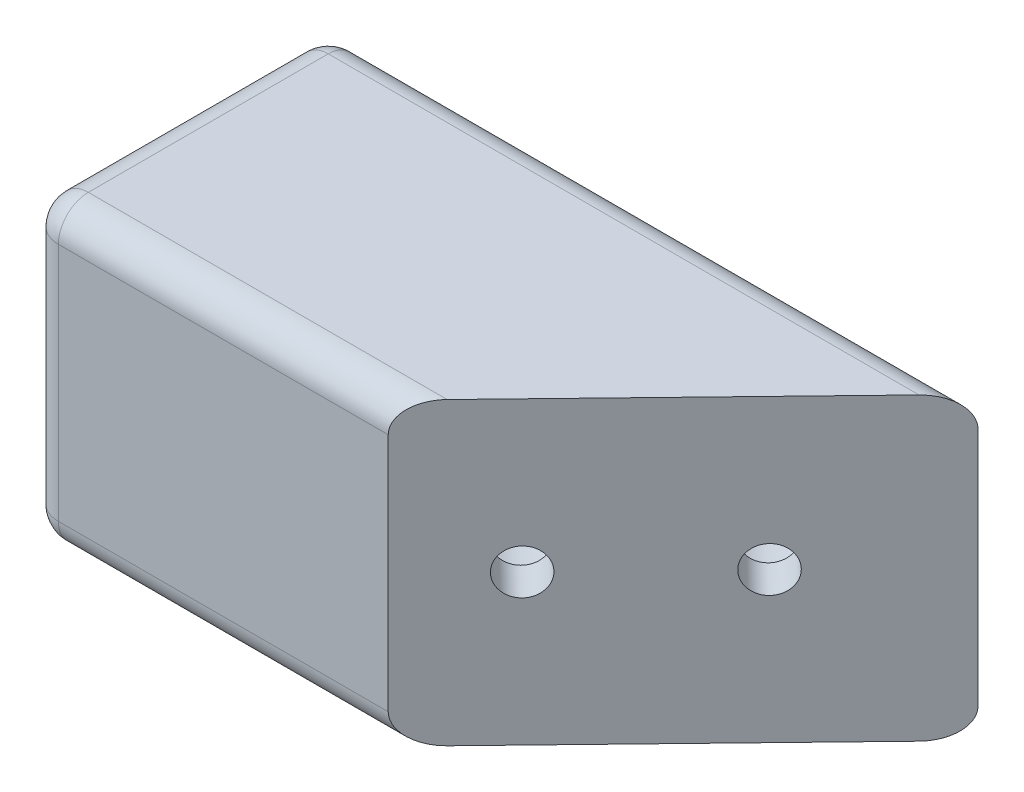
ISO-10303-21;
HEADER;
FILE_DESCRIPTION(('STEP AP214'),'2;1');
FILE_NAME('part.step','',(''),(''),'','','');
FILE_SCHEMA(('AUTOMOTIVE_DESIGN { 1 0 10303 214 1 1 1 1 }'));
ENDSEC;
DATA;
#1=APPLICATION_CONTEXT('core data for automotive mechanical design processes');
#2=APPLICATION_PROTOCOL_DEFINITION('international standard','automotive_design',2000,#1);
#3=PRODUCT_CONTEXT('',#1,'mechanical');
#4=PRODUCT('Part','Part','',(#3));
#5=PRODUCT_RELATED_PRODUCT_CATEGORY('part','',(#4));
#6=PRODUCT_DEFINITION_FORMATION('','',#4);
#7=PRODUCT_DEFINITION_CONTEXT('part definition',#1,'design');
#8=PRODUCT_DEFINITION('design','',#6,#7);
#9=PRODUCT_DEFINITION_SHAPE('','',#8);
#10=(LENGTH_UNIT() NAMED_UNIT(*) SI_UNIT(.MILLI.,.METRE.));
#11=(NAMED_UNIT(*) PLANE_ANGLE_UNIT() SI_UNIT($,.RADIAN.));
#12=(NAMED_UNIT(*) SI_UNIT($,.STERADIAN.) SOLID_ANGLE_UNIT());
#13=UNCERTAINTY_MEASURE_WITH_UNIT(LENGTH_MEASURE(1.E-05),#10,'distance_accuracy_value','');
#14=(GEOMETRIC_REPRESENTATION_CONTEXT(3) GLOBAL_UNCERTAINTY_ASSIGNED_CONTEXT((#13)) GLOBAL_UNIT_ASSIGNED_CONTEXT((#10,
#11,#12)) REPRESENTATION_CONTEXT('',''));
#15=CARTESIAN_POINT('',(0.,0.,0.));
#16=DIRECTION('',(0.,0.,1.));
#17=DIRECTION('',(1.,0.,0.));
#18=AXIS2_PLACEMENT_3D('',#15,#16,#17);
#19=CARTESIAN_POINT('',(-32.5,30.,-15.));
#20=DIRECTION('',(0.,0.,1.));
#21=DIRECTION('',(1.,0.,0.));
#22=AXIS2_PLACEMENT_3D('',#19,#20,#21);
#23=PLANE('',#22);
#24=CARTESIAN_POINT('',(-13.9014024104868,15.,-15.));
#25=DIRECTION('',(0.,0.,1.));
#26=DIRECTION('',(1.,0.,0.));
#27=AXIS2_PLACEMENT_3D('',#24,#25,#26);
#28=ELLIPSE('',#27,7.19401587759485,5.);
#29=CARTESIAN_POINT('',(-6.70738653289192,15.,-15.));
#30=VERTEX_POINT('',#29);
#31=EDGE_CURVE('E210',#30,#30,#28,.T.);
#32=ORIENTED_EDGE('',*,*,#31,.T.);
#33=EDGE_LOOP('',(#32));
#34=FACE_BOUND('',#33,.T.);
#35=CARTESIAN_POINT('',(11.2776531610952,15.,-15.));
#36=DIRECTION('',(0.,0.,1.));
#37=DIRECTION('',(1.,0.,0.));
#38=AXIS2_PLACEMENT_3D('',#35,#36,#37);
#39=ELLIPSE('',#38,7.19401587759485,5.);
#40=CARTESIAN_POINT('',(18.4716690386901,15.,-15.));
#41=VERTEX_POINT('',#40);
#42=EDGE_CURVE('E221',#41,#41,#39,.T.);
#43=ORIENTED_EDGE('',*,*,#42,.T.);
#44=EDGE_LOOP('',(#43));
#45=FACE_BOUND('',#44,.T.);
#46=DIRECTION('',(0.,-1.,0.));
#47=VECTOR('',#46,1.);
#48=CARTESIAN_POINT('',(32.5,30.,-15.));
#49=LINE('',#48,#47);
#50=CARTESIAN_POINT('',(32.5,27.,-15.));
#51=VERTEX_POINT('',#50);
#52=CARTESIAN_POINT('',(32.5,3.,-15.));
#53=VERTEX_POINT('',#52);
#54=EDGE_CURVE('E129',#51,#53,#49,.T.);
#55=ORIENTED_EDGE('',*,*,#54,.T.);
#56=DIRECTION('',(-1.,0.,0.));
#57=VECTOR('',#56,1.);
#58=CARTESIAN_POINT('',(-32.5,3.,-15.));
#59=LINE('',#58,#57);
#60=CARTESIAN_POINT('',(-29.5,3.,-15.));
#61=VERTEX_POINT('',#60);
#62=EDGE_CURVE('E11',#53,#61,#59,.T.);
#63=ORIENTED_EDGE('',*,*,#62,.T.);
#64=DIRECTION('',(0.,-1.,0.));
#65=VECTOR('',#64,1.);
#66=CARTESIAN_POINT('',(-29.5,30.,-15.));
#67=LINE('',#66,#65);
#68=CARTESIAN_POINT('',(-29.5,27.,-15.));
#69=VERTEX_POINT('',#68);
#70=EDGE_CURVE('E42',#61,#69,#67,.F.);
#71=ORIENTED_EDGE('',*,*,#70,.T.);
#72=DIRECTION('',(-1.,0.,0.));
#73=VECTOR('',#72,1.);
#74=CARTESIAN_POINT('',(32.5,27.,-15.));
#75=LINE('',#74,#73);
#76=EDGE_CURVE('E165',#69,#51,#75,.F.);
#77=ORIENTED_EDGE('',*,*,#76,.T.);
#78=EDGE_LOOP('',(#55,#63,#71,#77));
#79=FACE_BOUND('',#78,.T.);
#80=ADVANCED_FACE('F33',(#34,#45,#79),#23,.F.);
#81=CARTESIAN_POINT('',(-32.5,30.,15.));
#82=DIRECTION('',(1.,0.,0.));
#83=DIRECTION('',(0.,0.,-1.));
#84=AXIS2_PLACEMENT_3D('',#81,#82,#83);
#85=PLANE('',#84);
#86=DIRECTION('',(0.,0.,1.));
#87=VECTOR('',#86,1.);
#88=CARTESIAN_POINT('',(-32.5,3.,15.));
#89=LINE('',#88,#87);
#90=CARTESIAN_POINT('',(-32.5,3.,-12.));
#91=VERTEX_POINT('',#90);
#92=CARTESIAN_POINT('',(-32.5,3.,12.));
#93=VERTEX_POINT('',#92);
#94=EDGE_CURVE('E160',#91,#93,#89,.T.);
#95=ORIENTED_EDGE('',*,*,#94,.T.);
#96=DIRECTION('',(0.,-1.,0.));
#97=VECTOR('',#96,1.);
#98=CARTESIAN_POINT('',(-32.5,30.,12.));
#99=LINE('',#98,#97);
#100=CARTESIAN_POINT('',(-32.5,27.,12.));
#101=VERTEX_POINT('',#100);
#102=EDGE_CURVE('E162',#93,#101,#99,.F.);
#103=ORIENTED_EDGE('',*,*,#102,.T.);
#104=DIRECTION('',(0.,0.,1.));
#105=VECTOR('',#104,1.);
#106=CARTESIAN_POINT('',(-32.5,27.,-15.));
#107=LINE('',#106,#105);
#108=CARTESIAN_POINT('',(-32.5,27.,-12.));
#109=VERTEX_POINT('',#108);
#110=EDGE_CURVE('E156',#101,#109,#107,.F.);
#111=ORIENTED_EDGE('',*,*,#110,.T.);
#112=DIRECTION('',(0.,-1.,0.));
#113=VECTOR('',#112,1.);
#114=CARTESIAN_POINT('',(-32.5,30.,-12.));
#115=LINE('',#114,#113);
#116=EDGE_CURVE('E158',#109,#91,#115,.T.);
#117=ORIENTED_EDGE('',*,*,#116,.T.);
#118=EDGE_LOOP('',(#95,#103,#111,#117));
#119=FACE_BOUND('',#118,.T.);
#120=ADVANCED_FACE('F252',(#119),#85,.F.);
#121=CARTESIAN_POINT('',(-32.5,30.,15.));
#122=DIRECTION('',(0.,0.,-1.));
#123=DIRECTION('',(-1.,0.,0.));
#124=AXIS2_PLACEMENT_3D('',#121,#122,#123);
#125=PLANE('',#124);
#126=DIRECTION('',(0.,-1.,0.));
#127=VECTOR('',#126,1.);
#128=CARTESIAN_POINT('',(-29.5,30.,15.));
#129=LINE('',#128,#127);
#130=CARTESIAN_POINT('',(-29.5,27.,15.));
#131=VERTEX_POINT('',#130);
#132=CARTESIAN_POINT('',(-29.5,3.,15.));
#133=VERTEX_POINT('',#132);
#134=EDGE_CURVE('E128',#131,#133,#129,.T.);
#135=ORIENTED_EDGE('',*,*,#134,.T.);
#136=DIRECTION('',(1.,0.,0.));
#137=VECTOR('',#136,1.);
#138=CARTESIAN_POINT('',(-32.5,3.,15.));
#139=LINE('',#138,#137);
#140=CARTESIAN_POINT('',(3.49999999999999,3.,15.));
#141=VERTEX_POINT('',#140);
#142=EDGE_CURVE('E127',#133,#141,#139,.T.);
#143=ORIENTED_EDGE('',*,*,#142,.T.);
#144=DIRECTION('',(0.,-1.,0.));
#145=VECTOR('',#144,1.);
#146=CARTESIAN_POINT('',(3.49999999999999,30.,15.));
#147=LINE('',#146,#145);
#148=CARTESIAN_POINT('',(3.49999999999999,27.,15.));
#149=VERTEX_POINT('',#148);
#150=EDGE_CURVE('E112',#149,#141,#147,.T.);
#151=ORIENTED_EDGE('',*,*,#150,.F.);
#152=DIRECTION('',(1.,0.,0.));
#153=VECTOR('',#152,1.);
#154=CARTESIAN_POINT('',(-32.5,27.,15.));
#155=LINE('',#154,#153);
#156=EDGE_CURVE('E124',#149,#131,#155,.F.);
#157=ORIENTED_EDGE('',*,*,#156,.T.);
#158=EDGE_LOOP('',(#135,#143,#151,#157));
#159=FACE_BOUND('',#158,.T.);
#160=ADVANCED_FACE('F123',(#159),#125,.F.);
#161=CARTESIAN_POINT('',(3.49999999999999,30.,15.));
#162=DIRECTION('',(-0.718988376049112,0.,-0.695022096847475));
#163=DIRECTION('',(-0.695022096847475,0.,0.718988376049112));
#164=AXIS2_PLACEMENT_3D('',#161,#162,#163);
#165=PLANE('',#164);
#166=CARTESIAN_POINT('',(10.0855373766689,15.,8.18737512758386));
#167=DIRECTION('',(0.718988376049112,0.,0.695022096847475));
#168=DIRECTION('',(0.695022096847475,0.,-0.718988376049112));
#169=AXIS2_PLACEMENT_3D('',#166,#167,#168);
#170=CIRCLE('',#169,2.25);
#171=CARTESIAN_POINT('',(11.6493370945757,15.,6.56965128147336));
#172=VERTEX_POINT('',#171);
#173=EDGE_CURVE('E217',#172,#172,#170,.T.);
#174=ORIENTED_EDGE('',*,*,#173,.F.);
#175=EDGE_LOOP('',(#174));
#176=FACE_BOUND('',#175,.T.);
#177=CARTESIAN_POINT('',(22.2484240714997,15.,-4.3949214532756));
#178=DIRECTION('',(0.718988376049112,0.,0.695022096847475));
#179=DIRECTION('',(0.695022096847475,0.,-0.718988376049112));
#180=AXIS2_PLACEMENT_3D('',#177,#178,#179);
#181=CIRCLE('',#180,2.25);
#182=CARTESIAN_POINT('',(23.8122237894066,15.,-6.0126452993861));
#183=VERTEX_POINT('',#182);
#184=EDGE_CURVE('E220',#183,#183,#181,.T.);
#185=ORIENTED_EDGE('',*,*,#184,.F.);
#186=EDGE_LOOP('',(#185));
#187=FACE_BOUND('',#186,.T.);
#188=ORIENTED_EDGE('',*,*,#150,.T.);
#189=CARTESIAN_POINT('',(6.39999999999999,3.,12.));
#190=DIRECTION('',(-0.718988376049112,0.,-0.695022096847475));
#191=DIRECTION('',(0.695022096847475,0.,-0.718988376049112));
#192=AXIS2_PLACEMENT_3D('',#189,#190,#191);
#193=ELLIPSE('',#192,4.17252920900501,3.);
#194=CARTESIAN_POINT('',(6.39999999999999,0.,12.));
#195=VERTEX_POINT('',#194);
#196=EDGE_CURVE('E118',#141,#195,#193,.F.);
#197=ORIENTED_EDGE('',*,*,#196,.T.);
#198=DIRECTION('',(0.695022096847475,0.,-0.718988376049112));
#199=VECTOR('',#198,1.);
#200=CARTESIAN_POINT('',(3.49999999999999,0.,15.));
#201=LINE('',#200,#199);
#202=CARTESIAN_POINT('',(29.6,0.,-12.));
#203=VERTEX_POINT('',#202);
#204=EDGE_CURVE('E224',#195,#203,#201,.T.);
#205=ORIENTED_EDGE('',*,*,#204,.T.);
#206=CARTESIAN_POINT('',(29.6,3.,-12.));
#207=DIRECTION('',(-0.718988376049112,0.,-0.695022096847475));
#208=DIRECTION('',(-0.695022096847475,0.,0.718988376049112));
#209=AXIS2_PLACEMENT_3D('',#206,#207,#208);
#210=ELLIPSE('',#209,4.17252920900501,3.);
#211=EDGE_CURVE('E119',#203,#53,#210,.F.);
#212=ORIENTED_EDGE('',*,*,#211,.T.);
#213=ORIENTED_EDGE('',*,*,#54,.F.);
#214=CARTESIAN_POINT('',(29.6,27.,-12.));
#215=DIRECTION('',(-0.718988376049112,0.,-0.695022096847475));
#216=DIRECTION('',(0.695022096847475,0.,-0.718988376049112));
#217=AXIS2_PLACEMENT_3D('',#214,#215,#216);
#218=ELLIPSE('',#217,4.17252920900501,3.);
#219=CARTESIAN_POINT('',(29.6,30.,-12.));
#220=VERTEX_POINT('',#219);
#221=EDGE_CURVE('E136',#51,#220,#218,.F.);
#222=ORIENTED_EDGE('',*,*,#221,.T.);
#223=DIRECTION('',(0.695022096847475,0.,-0.718988376049112));
#224=VECTOR('',#223,1.);
#225=CARTESIAN_POINT('',(3.49999999999999,30.,15.));
#226=LINE('',#225,#224);
#227=CARTESIAN_POINT('',(6.39999999999999,30.,12.));
#228=VERTEX_POINT('',#227);
#229=EDGE_CURVE('E114',#228,#220,#226,.T.);
#230=ORIENTED_EDGE('',*,*,#229,.F.);
#231=CARTESIAN_POINT('',(6.39999999999999,27.,12.));
#232=DIRECTION('',(-0.718988376049112,0.,-0.695022096847475));
#233=DIRECTION('',(-0.695022096847475,0.,0.718988376049112));
#234=AXIS2_PLACEMENT_3D('',#231,#232,#233);
#235=ELLIPSE('',#234,4.17252920900501,3.);
#236=EDGE_CURVE('E109',#228,#149,#235,.F.);
#237=ORIENTED_EDGE('',*,*,#236,.T.);
#238=EDGE_LOOP('',(#188,#197,#205,#212,#213,#222,#230,#237));
#239=FACE_BOUND('',#238,.T.);
#240=ADVANCED_FACE('F111',(#176,#187,#239),#165,.F.);
#241=CARTESIAN_POINT('',(0.,30.,0.));
#242=DIRECTION('',(0.,1.,0.));
#243=DIRECTION('',(0.,0.,1.));
#244=AXIS2_PLACEMENT_3D('',#241,#242,#243);
#245=PLANE('',#244);
#246=DIRECTION('',(0.,0.,1.));
#247=VECTOR('',#246,1.);
#248=CARTESIAN_POINT('',(-29.5,30.,15.));
#249=LINE('',#248,#247);
#250=CARTESIAN_POINT('',(-29.5,30.,-12.));
#251=VERTEX_POINT('',#250);
#252=CARTESIAN_POINT('',(-29.5,30.,12.));
#253=VERTEX_POINT('',#252);
#254=EDGE_CURVE('E152',#251,#253,#249,.T.);
#255=ORIENTED_EDGE('',*,*,#254,.T.);
#256=DIRECTION('',(1.,0.,0.));
#257=VECTOR('',#256,1.);
#258=CARTESIAN_POINT('',(3.49999999999999,30.,12.));
#259=LINE('',#258,#257);
#260=EDGE_CURVE('E154',#253,#228,#259,.T.);
#261=ORIENTED_EDGE('',*,*,#260,.T.);
#262=ORIENTED_EDGE('',*,*,#229,.T.);
#263=DIRECTION('',(-1.,0.,0.));
#264=VECTOR('',#263,1.);
#265=CARTESIAN_POINT('',(-32.5,30.,-12.));
#266=LINE('',#265,#264);
#267=EDGE_CURVE('E150',#220,#251,#266,.T.);
#268=ORIENTED_EDGE('',*,*,#267,.T.);
#269=EDGE_LOOP('',(#255,#261,#262,#268));
#270=FACE_BOUND('',#269,.T.);
#271=ADVANCED_FACE('F308',(#270),#245,.T.);
#272=CARTESIAN_POINT('',(0.,0.,0.));
#273=DIRECTION('',(0.,1.,0.));
#274=DIRECTION('',(0.,0.,1.));
#275=AXIS2_PLACEMENT_3D('',#272,#273,#274);
#276=PLANE('',#275);
#277=ORIENTED_EDGE('',*,*,#204,.F.);
#278=DIRECTION('',(1.,0.,0.));
#279=VECTOR('',#278,1.);
#280=CARTESIAN_POINT('',(0.,0.,12.));
#281=LINE('',#280,#279);
#282=CARTESIAN_POINT('',(-29.5,0.,12.));
#283=VERTEX_POINT('',#282);
#284=EDGE_CURVE('E148',#195,#283,#281,.F.);
#285=ORIENTED_EDGE('',*,*,#284,.T.);
#286=DIRECTION('',(0.,0.,1.));
#287=VECTOR('',#286,1.);
#288=CARTESIAN_POINT('',(-29.5,0.,0.));
#289=LINE('',#288,#287);
#290=CARTESIAN_POINT('',(-29.5,0.,-12.));
#291=VERTEX_POINT('',#290);
#292=EDGE_CURVE('E146',#283,#291,#289,.F.);
#293=ORIENTED_EDGE('',*,*,#292,.T.);
#294=DIRECTION('',(-1.,0.,0.));
#295=VECTOR('',#294,1.);
#296=CARTESIAN_POINT('',(0.,0.,-12.));
#297=LINE('',#296,#295);
#298=EDGE_CURVE('E144',#291,#203,#297,.F.);
#299=ORIENTED_EDGE('',*,*,#298,.T.);
#300=EDGE_LOOP('',(#277,#285,#293,#299));
#301=FACE_BOUND('',#300,.T.);
#302=ADVANCED_FACE('F327',(#301),#276,.F.);
#303=CARTESIAN_POINT('',(-11.3529544465933,15.,-36.8762540207656));
#304=DIRECTION('',(0.718988376049112,0.,0.695022096847475));
#305=DIRECTION('',(0.695022096847475,0.,-0.718988376049112));
#306=AXIS2_PLACEMENT_3D('',#303,#304,#305);
#307=CYLINDRICAL_SURFACE('',#306,2.25);
#308=CARTESIAN_POINT('',(19.3724705673033,15.,-7.17500984066549));
#309=DIRECTION('',(0.718988376049112,0.,0.695022096847475));
#310=DIRECTION('',(0.695022096847475,0.,-0.718988376049112));
#311=AXIS2_PLACEMENT_3D('',#308,#309,#310);
#312=CIRCLE('',#311,2.25);
#313=CARTESIAN_POINT('',(20.9362702852101,15.,-8.792733686776));
#314=VERTEX_POINT('',#313);
#315=EDGE_CURVE('E216',#314,#314,#312,.F.);
#316=ORIENTED_EDGE('',*,*,#315,.T.);
#317=EDGE_LOOP('',(#316));
#318=FACE_BOUND('',#317,.T.);
#319=ORIENTED_EDGE('',*,*,#184,.T.);
#320=EDGE_LOOP('',(#319));
#321=FACE_BOUND('',#320,.T.);
#322=ADVANCED_FACE('F329',(#318,#321),#307,.F.);
#323=CARTESIAN_POINT('',(-23.5158411414241,15.,-24.2939574399061));
#324=DIRECTION('',(0.718988376049112,0.,0.695022096847475));
#325=DIRECTION('',(0.695022096847475,0.,-0.718988376049112));
#326=AXIS2_PLACEMENT_3D('',#323,#324,#325);
#327=CYLINDRICAL_SURFACE('',#326,2.25);
#328=CARTESIAN_POINT('',(7.20958387247248,15.,5.40728674019396));
#329=DIRECTION('',(0.718988376049112,0.,0.695022096847475));
#330=DIRECTION('',(0.695022096847475,0.,-0.718988376049112));
#331=AXIS2_PLACEMENT_3D('',#328,#329,#330);
#332=CIRCLE('',#331,2.25);
#333=CARTESIAN_POINT('',(8.7733835903793,15.,3.78956289408345));
#334=VERTEX_POINT('',#333);
#335=EDGE_CURVE('E205',#334,#334,#332,.F.);
#336=ORIENTED_EDGE('',*,*,#335,.T.);
#337=EDGE_LOOP('',(#336));
#338=FACE_BOUND('',#337,.T.);
#339=ORIENTED_EDGE('',*,*,#173,.T.);
#340=EDGE_LOOP('',(#339));
#341=FACE_BOUND('',#340,.T.);
#342=ADVANCED_FACE('F336',(#338,#341),#327,.F.);
#343=CARTESIAN_POINT('',(-11.3529544465933,15.,-36.8762540207656));
#344=DIRECTION('',(0.718988376049112,0.,0.695022096847475));
#345=DIRECTION('',(0.695022096847475,0.,-0.718988376049112));
#346=AXIS2_PLACEMENT_3D('',#343,#344,#345);
#347=CYLINDRICAL_SURFACE('',#346,5.);
#348=CARTESIAN_POINT('',(19.3724705673033,15.,-7.17500984066551));
#349=DIRECTION('',(0.718988376049112,0.,0.695022096847475));
#350=DIRECTION('',(0.695022096847475,0.,-0.718988376049112));
#351=AXIS2_PLACEMENT_3D('',#348,#349,#350);
#352=CIRCLE('',#351,5.);
#353=CARTESIAN_POINT('',(22.8475810515407,15.,-10.7699517209111));
#354=VERTEX_POINT('',#353);
#355=EDGE_CURVE('E213',#354,#354,#352,.T.);
#356=ORIENTED_EDGE('',*,*,#355,.T.);
#357=EDGE_LOOP('',(#356));
#358=FACE_BOUND('',#357,.T.);
#359=ORIENTED_EDGE('',*,*,#42,.F.);
#360=EDGE_LOOP('',(#359));
#361=FACE_BOUND('',#360,.T.);
#362=ADVANCED_FACE('F248',(#358,#361),#347,.F.);
#363=CARTESIAN_POINT('',(19.3724705673033,15.,-7.17500984066551));
#364=DIRECTION('',(0.718988376049112,0.,0.695022096847475));
#365=DIRECTION('',(0.695022096847475,0.,-0.718988376049112));
#366=AXIS2_PLACEMENT_3D('',#363,#364,#365);
#367=PLANE('',#366);
#368=ORIENTED_EDGE('',*,*,#355,.F.);
#369=EDGE_LOOP('',(#368));
#370=FACE_BOUND('',#369,.T.);
#371=ORIENTED_EDGE('',*,*,#315,.F.);
#372=EDGE_LOOP('',(#371));
#373=FACE_BOUND('',#372,.T.);
#374=ADVANCED_FACE('F240',(#370,#373),#367,.F.);
#375=CARTESIAN_POINT('',(-23.5158411414241,15.,-24.2939574399061));
#376=DIRECTION('',(0.718988376049112,0.,0.695022096847475));
#377=DIRECTION('',(0.695022096847475,0.,-0.718988376049112));
#378=AXIS2_PLACEMENT_3D('',#375,#376,#377);
#379=CYLINDRICAL_SURFACE('',#378,5.);
#380=CARTESIAN_POINT('',(7.20958387247248,15.,5.40728674019396));
#381=DIRECTION('',(0.718988376049112,0.,0.695022096847475));
#382=DIRECTION('',(0.695022096847475,0.,-0.718988376049112));
#383=AXIS2_PLACEMENT_3D('',#380,#381,#382);
#384=CIRCLE('',#383,5.);
#385=CARTESIAN_POINT('',(10.6846943567099,15.,1.8123448599484));
#386=VERTEX_POINT('',#385);
#387=EDGE_CURVE('E200',#386,#386,#384,.T.);
#388=ORIENTED_EDGE('',*,*,#387,.T.);
#389=EDGE_LOOP('',(#388));
#390=FACE_BOUND('',#389,.T.);
#391=ORIENTED_EDGE('',*,*,#31,.F.);
#392=EDGE_LOOP('',(#391));
#393=FACE_BOUND('',#392,.T.);
#394=ADVANCED_FACE('F237',(#390,#393),#379,.F.);
#395=CARTESIAN_POINT('',(7.20958387247248,15.,5.40728674019396));
#396=DIRECTION('',(0.718988376049112,0.,0.695022096847475));
#397=DIRECTION('',(0.695022096847475,0.,-0.718988376049112));
#398=AXIS2_PLACEMENT_3D('',#395,#396,#397);
#399=PLANE('',#398);
#400=ORIENTED_EDGE('',*,*,#387,.F.);
#401=EDGE_LOOP('',(#400));
#402=FACE_BOUND('',#401,.T.);
#403=ORIENTED_EDGE('',*,*,#335,.F.);
#404=EDGE_LOOP('',(#403));
#405=FACE_BOUND('',#404,.T.);
#406=ADVANCED_FACE('F239',(#402,#405),#399,.F.);
#407=CARTESIAN_POINT('',(0.,27.,-12.));
#408=DIRECTION('',(1.,0.,0.));
#409=DIRECTION('',(0.,0.,-1.));
#410=AXIS2_PLACEMENT_3D('',#407,#408,#409);
#411=CYLINDRICAL_SURFACE('',#410,3.);
#412=CARTESIAN_POINT('',(-29.5,27.,-12.));
#413=DIRECTION('',(-1.,0.,0.));
#414=DIRECTION('',(0.,0.,1.));
#415=AXIS2_PLACEMENT_3D('',#412,#413,#414);
#416=CIRCLE('',#415,3.);
#417=EDGE_CURVE('E37',#251,#69,#416,.T.);
#418=ORIENTED_EDGE('',*,*,#417,.F.);
#419=ORIENTED_EDGE('',*,*,#267,.F.);
#420=ORIENTED_EDGE('',*,*,#221,.F.);
#421=ORIENTED_EDGE('',*,*,#76,.F.);
#422=EDGE_LOOP('',(#418,#419,#420,#421));
#423=FACE_BOUND('',#422,.T.);
#424=ADVANCED_FACE('F35',(#423),#411,.T.);
#425=CARTESIAN_POINT('',(-29.5,27.,-12.));
#426=DIRECTION('',(0.,0.,1.));
#427=DIRECTION('',(1.,0.,0.));
#428=AXIS2_PLACEMENT_3D('',#425,#426,#427);
#429=SPHERICAL_SURFACE('',#428,3.);
#430=CARTESIAN_POINT('',(-29.5,27.,-12.));
#431=DIRECTION('',(0.,0.,-1.));
#432=DIRECTION('',(-1.,0.,0.));
#433=AXIS2_PLACEMENT_3D('',#430,#431,#432);
#434=CIRCLE('',#433,3.);
#435=EDGE_CURVE('E192',#251,#109,#434,.F.);
#436=ORIENTED_EDGE('',*,*,#435,.F.);
#437=ORIENTED_EDGE('',*,*,#417,.T.);
#438=CARTESIAN_POINT('',(-29.5,27.,-12.));
#439=DIRECTION('',(0.,1.,0.));
#440=DIRECTION('',(0.,0.,1.));
#441=AXIS2_PLACEMENT_3D('',#438,#439,#440);
#442=CIRCLE('',#441,3.);
#443=EDGE_CURVE('E194',#109,#69,#442,.F.);
#444=ORIENTED_EDGE('',*,*,#443,.F.);
#445=EDGE_LOOP('',(#436,#437,#444));
#446=FACE_BOUND('',#445,.T.);
#447=ADVANCED_FACE('F297',(#446),#429,.T.);
#448=CARTESIAN_POINT('',(-32.5,3.,-12.));
#449=DIRECTION('',(-1.,0.,0.));
#450=DIRECTION('',(0.,0.,1.));
#451=AXIS2_PLACEMENT_3D('',#448,#449,#450);
#452=CYLINDRICAL_SURFACE('',#451,3.);
#453=ORIENTED_EDGE('',*,*,#211,.F.);
#454=ORIENTED_EDGE('',*,*,#298,.F.);
#455=CARTESIAN_POINT('',(-29.5,3.,-12.));
#456=DIRECTION('',(-1.,0.,0.));
#457=DIRECTION('',(0.,0.,1.));
#458=AXIS2_PLACEMENT_3D('',#455,#456,#457);
#459=CIRCLE('',#458,3.);
#460=EDGE_CURVE('E189',#61,#291,#459,.T.);
#461=ORIENTED_EDGE('',*,*,#460,.F.);
#462=ORIENTED_EDGE('',*,*,#62,.F.);
#463=EDGE_LOOP('',(#453,#454,#461,#462));
#464=FACE_BOUND('',#463,.T.);
#465=ADVANCED_FACE('F295',(#464),#452,.T.);
#466=CARTESIAN_POINT('',(-29.5,30.,-12.));
#467=DIRECTION('',(0.,-1.,0.));
#468=DIRECTION('',(0.,0.,-1.));
#469=AXIS2_PLACEMENT_3D('',#466,#467,#468);
#470=CYLINDRICAL_SURFACE('',#469,3.);
#471=ORIENTED_EDGE('',*,*,#443,.T.);
#472=ORIENTED_EDGE('',*,*,#70,.F.);
#473=CARTESIAN_POINT('',(-29.5,3.,-12.));
#474=DIRECTION('',(0.,-1.,0.));
#475=DIRECTION('',(0.,0.,-1.));
#476=AXIS2_PLACEMENT_3D('',#473,#474,#475);
#477=CIRCLE('',#476,3.);
#478=EDGE_CURVE('E186',#91,#61,#477,.T.);
#479=ORIENTED_EDGE('',*,*,#478,.F.);
#480=ORIENTED_EDGE('',*,*,#116,.F.);
#481=EDGE_LOOP('',(#471,#472,#479,#480));
#482=FACE_BOUND('',#481,.T.);
#483=ADVANCED_FACE('F291',(#482),#470,.T.);
#484=CARTESIAN_POINT('',(-29.5,27.,0.));
#485=DIRECTION('',(0.,0.,-1.));
#486=DIRECTION('',(-1.,0.,0.));
#487=AXIS2_PLACEMENT_3D('',#484,#485,#486);
#488=CYLINDRICAL_SURFACE('',#487,3.);
#489=ORIENTED_EDGE('',*,*,#435,.T.);
#490=ORIENTED_EDGE('',*,*,#110,.F.);
#491=CARTESIAN_POINT('',(-29.5,27.,12.));
#492=DIRECTION('',(0.,0.,1.));
#493=DIRECTION('',(1.,0.,0.));
#494=AXIS2_PLACEMENT_3D('',#491,#492,#493);
#495=CIRCLE('',#494,3.);
#496=EDGE_CURVE('E183',#253,#101,#495,.T.);
#497=ORIENTED_EDGE('',*,*,#496,.F.);
#498=ORIENTED_EDGE('',*,*,#254,.F.);
#499=EDGE_LOOP('',(#489,#490,#497,#498));
#500=FACE_BOUND('',#499,.T.);
#501=ADVANCED_FACE('F288',(#500),#488,.T.);
#502=CARTESIAN_POINT('',(0.,27.,12.));
#503=DIRECTION('',(-1.,0.,0.));
#504=DIRECTION('',(0.,0.,1.));
#505=AXIS2_PLACEMENT_3D('',#502,#503,#504);
#506=CYLINDRICAL_SURFACE('',#505,3.);
#507=ORIENTED_EDGE('',*,*,#236,.F.);
#508=ORIENTED_EDGE('',*,*,#260,.F.);
#509=CARTESIAN_POINT('',(-29.5,27.,12.));
#510=DIRECTION('',(-1.,0.,0.));
#511=DIRECTION('',(0.,0.,1.));
#512=AXIS2_PLACEMENT_3D('',#509,#510,#511);
#513=CIRCLE('',#512,3.);
#514=EDGE_CURVE('E133',#131,#253,#513,.T.);
#515=ORIENTED_EDGE('',*,*,#514,.F.);
#516=ORIENTED_EDGE('',*,*,#156,.F.);
#517=EDGE_LOOP('',(#507,#508,#515,#516));
#518=FACE_BOUND('',#517,.T.);
#519=ADVANCED_FACE('F131',(#518),#506,.T.);
#520=CARTESIAN_POINT('',(-29.5,3.,-12.));
#521=DIRECTION('',(0.,0.,1.));
#522=DIRECTION('',(1.,0.,0.));
#523=AXIS2_PLACEMENT_3D('',#520,#521,#522);
#524=SPHERICAL_SURFACE('',#523,3.);
#525=ORIENTED_EDGE('',*,*,#478,.T.);
#526=ORIENTED_EDGE('',*,*,#460,.T.);
#527=CARTESIAN_POINT('',(-29.5,3.,-12.));
#528=DIRECTION('',(0.,0.,-1.));
#529=DIRECTION('',(-1.,0.,0.));
#530=AXIS2_PLACEMENT_3D('',#527,#528,#529);
#531=CIRCLE('',#530,3.);
#532=EDGE_CURVE('E179',#91,#291,#531,.F.);
#533=ORIENTED_EDGE('',*,*,#532,.F.);
#534=EDGE_LOOP('',(#525,#526,#533));
#535=FACE_BOUND('',#534,.T.);
#536=ADVANCED_FACE('F281',(#535),#524,.T.);
#537=CARTESIAN_POINT('',(-29.5,27.,12.));
#538=DIRECTION('',(0.,0.,1.));
#539=DIRECTION('',(1.,0.,0.));
#540=AXIS2_PLACEMENT_3D('',#537,#538,#539);
#541=SPHERICAL_SURFACE('',#540,3.);
#542=ORIENTED_EDGE('',*,*,#514,.T.);
#543=ORIENTED_EDGE('',*,*,#496,.T.);
#544=CARTESIAN_POINT('',(-29.5,27.,12.));
#545=DIRECTION('',(0.,1.,0.));
#546=DIRECTION('',(0.,0.,1.));
#547=AXIS2_PLACEMENT_3D('',#544,#545,#546);
#548=CIRCLE('',#547,3.);
#549=EDGE_CURVE('E177',#131,#101,#548,.F.);
#550=ORIENTED_EDGE('',*,*,#549,.F.);
#551=EDGE_LOOP('',(#542,#543,#550));
#552=FACE_BOUND('',#551,.T.);
#553=ADVANCED_FACE('F277',(#552),#541,.T.);
#554=CARTESIAN_POINT('',(-29.5,3.,15.));
#555=DIRECTION('',(0.,0.,1.));
#556=DIRECTION('',(1.,0.,0.));
#557=AXIS2_PLACEMENT_3D('',#554,#555,#556);
#558=CYLINDRICAL_SURFACE('',#557,3.);
#559=ORIENTED_EDGE('',*,*,#532,.T.);
#560=ORIENTED_EDGE('',*,*,#292,.F.);
#561=CARTESIAN_POINT('',(-29.5,3.,12.));
#562=DIRECTION('',(0.,0.,1.));
#563=DIRECTION('',(1.,0.,0.));
#564=AXIS2_PLACEMENT_3D('',#561,#562,#563);
#565=CIRCLE('',#564,3.);
#566=EDGE_CURVE('E174',#93,#283,#565,.T.);
#567=ORIENTED_EDGE('',*,*,#566,.F.);
#568=ORIENTED_EDGE('',*,*,#94,.F.);
#569=EDGE_LOOP('',(#559,#560,#567,#568));
#570=FACE_BOUND('',#569,.T.);
#571=ADVANCED_FACE('F273',(#570),#558,.T.);
#572=CARTESIAN_POINT('',(-29.5,30.,12.));
#573=DIRECTION('',(0.,-1.,0.));
#574=DIRECTION('',(0.,0.,-1.));
#575=AXIS2_PLACEMENT_3D('',#572,#573,#574);
#576=CYLINDRICAL_SURFACE('',#575,3.);
#577=ORIENTED_EDGE('',*,*,#549,.T.);
#578=ORIENTED_EDGE('',*,*,#102,.F.);
#579=CARTESIAN_POINT('',(-29.5,3.,12.));
#580=DIRECTION('',(0.,-1.,0.));
#581=DIRECTION('',(0.,0.,-1.));
#582=AXIS2_PLACEMENT_3D('',#579,#580,#581);
#583=CIRCLE('',#582,3.);
#584=EDGE_CURVE('E171',#133,#93,#583,.T.);
#585=ORIENTED_EDGE('',*,*,#584,.F.);
#586=ORIENTED_EDGE('',*,*,#134,.F.);
#587=EDGE_LOOP('',(#577,#578,#585,#586));
#588=FACE_BOUND('',#587,.T.);
#589=ADVANCED_FACE('F269',(#588),#576,.T.);
#590=CARTESIAN_POINT('',(-29.5,3.,12.));
#591=DIRECTION('',(0.,0.,1.));
#592=DIRECTION('',(1.,0.,0.));
#593=AXIS2_PLACEMENT_3D('',#590,#591,#592);
#594=SPHERICAL_SURFACE('',#593,3.);
#595=ORIENTED_EDGE('',*,*,#584,.T.);
#596=ORIENTED_EDGE('',*,*,#566,.T.);
#597=CARTESIAN_POINT('',(-29.5,3.,12.));
#598=DIRECTION('',(-1.,0.,0.));
#599=DIRECTION('',(0.,0.,1.));
#600=AXIS2_PLACEMENT_3D('',#597,#598,#599);
#601=CIRCLE('',#600,3.);
#602=EDGE_CURVE('E168',#133,#283,#601,.F.);
#603=ORIENTED_EDGE('',*,*,#602,.F.);
#604=EDGE_LOOP('',(#595,#596,#603));
#605=FACE_BOUND('',#604,.T.);
#606=ADVANCED_FACE('F265',(#605),#594,.T.);
#607=CARTESIAN_POINT('',(-32.5,3.,12.));
#608=DIRECTION('',(1.,0.,0.));
#609=DIRECTION('',(0.,0.,-1.));
#610=AXIS2_PLACEMENT_3D('',#607,#608,#609);
#611=CYLINDRICAL_SURFACE('',#610,3.);
#612=ORIENTED_EDGE('',*,*,#602,.T.);
#613=ORIENTED_EDGE('',*,*,#284,.F.);
#614=ORIENTED_EDGE('',*,*,#196,.F.);
#615=ORIENTED_EDGE('',*,*,#142,.F.);
#616=EDGE_LOOP('',(#612,#613,#614,#615));
#617=FACE_BOUND('',#616,.T.);
#618=ADVANCED_FACE('F262',(#617),#611,.T.);
#619=CLOSED_SHELL('',(#80,#120,#160,#240,#271,#302,#322,#342,#362,#374,#394,#406,#424,#447,#465,
#483,#501,#519,#536,#553,#571,#589,#606,#618));
#620=MANIFOLD_SOLID_BREP('B2',#619);
#621=ADVANCED_BREP_SHAPE_REPRESENTATION('',(#18,#620),#14);
#622=SHAPE_DEFINITION_REPRESENTATION(#9,#621);
ENDSEC;
END-ISO-10303-21;
